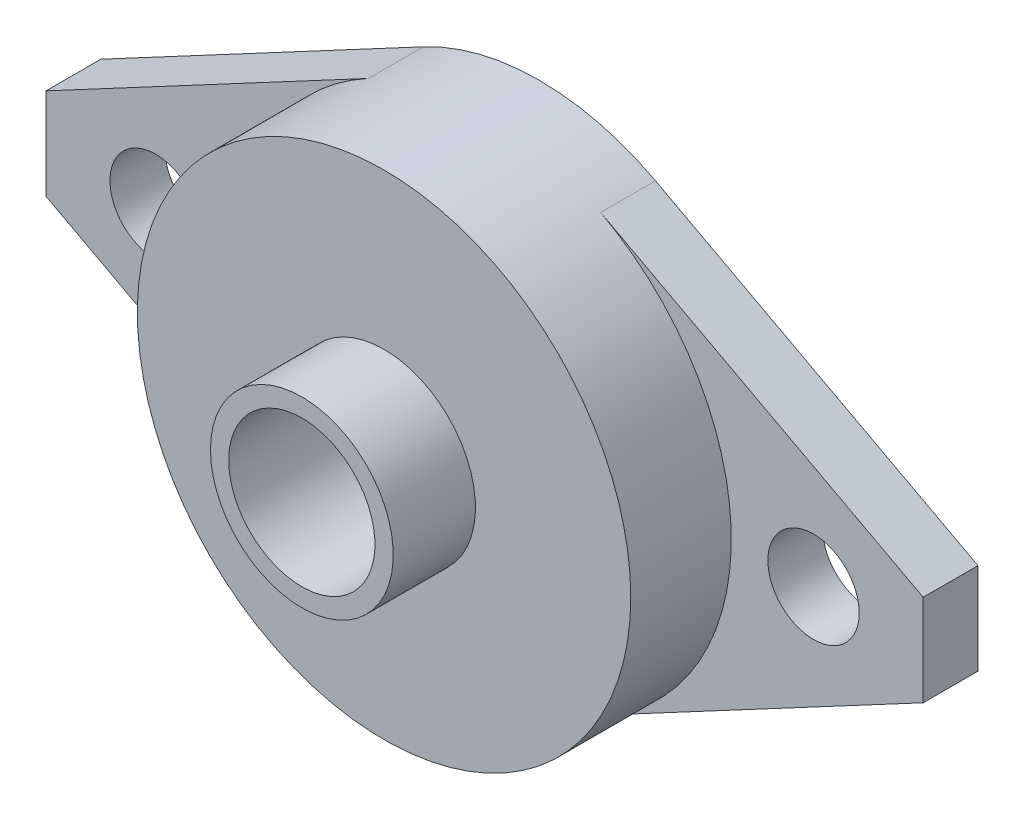
ISO-10303-21;
HEADER;
FILE_DESCRIPTION(('STEP AP214'),'2;1');
FILE_NAME('part.step','',(''),(''),'','','');
FILE_SCHEMA(('AUTOMOTIVE_DESIGN { 1 0 10303 214 1 1 1 1 }'));
ENDSEC;
DATA;
#1=APPLICATION_CONTEXT('core data for automotive mechanical design processes');
#2=APPLICATION_PROTOCOL_DEFINITION('international standard','automotive_design',2000,#1);
#3=PRODUCT_CONTEXT('',#1,'mechanical');
#4=PRODUCT('Part','Part','',(#3));
#5=PRODUCT_RELATED_PRODUCT_CATEGORY('part','',(#4));
#6=PRODUCT_DEFINITION_FORMATION('','',#4);
#7=PRODUCT_DEFINITION_CONTEXT('part definition',#1,'design');
#8=PRODUCT_DEFINITION('design','',#6,#7);
#9=PRODUCT_DEFINITION_SHAPE('','',#8);
#10=(LENGTH_UNIT() NAMED_UNIT(*) SI_UNIT(.MILLI.,.METRE.));
#11=(NAMED_UNIT(*) PLANE_ANGLE_UNIT() SI_UNIT($,.RADIAN.));
#12=(NAMED_UNIT(*) SI_UNIT($,.STERADIAN.) SOLID_ANGLE_UNIT());
#13=UNCERTAINTY_MEASURE_WITH_UNIT(LENGTH_MEASURE(1.E-05),#10,'distance_accuracy_value','');
#14=(GEOMETRIC_REPRESENTATION_CONTEXT(3) GLOBAL_UNCERTAINTY_ASSIGNED_CONTEXT((#13)) GLOBAL_UNIT_ASSIGNED_CONTEXT((#10,
#11,#12)) REPRESENTATION_CONTEXT('',''));
#15=CARTESIAN_POINT('',(0.,0.,0.));
#16=DIRECTION('',(0.,0.,1.));
#17=DIRECTION('',(1.,0.,0.));
#18=AXIS2_PLACEMENT_3D('',#15,#16,#17);
#19=CARTESIAN_POINT('',(0.,0.,3.));
#20=DIRECTION('',(0.,0.,1.));
#21=DIRECTION('',(1.,0.,0.));
#22=AXIS2_PLACEMENT_3D('',#19,#20,#21);
#23=PLANE('',#22);
#24=CARTESIAN_POINT('',(-18.,0.,3.));
#25=DIRECTION('',(0.,0.,1.));
#26=DIRECTION('',(1.,0.,0.));
#27=AXIS2_PLACEMENT_3D('',#24,#25,#26);
#28=CIRCLE('',#27,2.5);
#29=CARTESIAN_POINT('',(-15.5,0.,3.));
#30=VERTEX_POINT('',#29);
#31=EDGE_CURVE('E153',#30,#30,#28,.T.);
#32=ORIENTED_EDGE('',*,*,#31,.F.);
#33=EDGE_LOOP('',(#32));
#34=FACE_BOUND('',#33,.T.);
#35=DIRECTION('',(0.882352941176471,-0.470588235294118,0.));
#36=VECTOR('',#35,1.);
#37=CARTESIAN_POINT('',(-6.35294117647059,-11.9117647058824,3.));
#38=LINE('',#37,#36);
#39=CARTESIAN_POINT('',(-24.,-2.5,3.));
#40=VERTEX_POINT('',#39);
#41=CARTESIAN_POINT('',(-6.35294117647059,-11.9117647058824,3.));
#42=VERTEX_POINT('',#41);
#43=EDGE_CURVE('E184',#40,#42,#38,.T.);
#44=ORIENTED_EDGE('',*,*,#43,.T.);
#45=CARTESIAN_POINT('',(0.,0.,3.));
#46=DIRECTION('',(0.,0.,1.));
#47=DIRECTION('',(1.,0.,0.));
#48=AXIS2_PLACEMENT_3D('',#45,#46,#47);
#49=CIRCLE('',#48,13.5);
#50=CARTESIAN_POINT('',(-6.35294117647059,11.9117647058824,3.));
#51=VERTEX_POINT('',#50);
#52=EDGE_CURVE('E162',#42,#51,#49,.F.);
#53=ORIENTED_EDGE('',*,*,#52,.T.);
#54=DIRECTION('',(0.882352941176471,0.470588235294118,0.));
#55=VECTOR('',#54,1.);
#56=CARTESIAN_POINT('',(-6.35294117647059,11.9117647058824,3.));
#57=LINE('',#56,#55);
#58=CARTESIAN_POINT('',(-24.,2.5,3.));
#59=VERTEX_POINT('',#58);
#60=EDGE_CURVE('E145',#59,#51,#57,.T.);
#61=ORIENTED_EDGE('',*,*,#60,.F.);
#62=DIRECTION('',(0.,1.,0.));
#63=VECTOR('',#62,1.);
#64=CARTESIAN_POINT('',(-24.,0.,3.));
#65=LINE('',#64,#63);
#66=EDGE_CURVE('E148',#40,#59,#65,.T.);
#67=ORIENTED_EDGE('',*,*,#66,.F.);
#68=EDGE_LOOP('',(#44,#53,#61,#67));
#69=FACE_BOUND('',#68,.T.);
#70=ADVANCED_FACE('F56',(#34,#69),#23,.T.);
#71=CARTESIAN_POINT('',(-6.35294117647059,-11.9117647058824,3.));
#72=DIRECTION('',(0.470588235294118,0.882352941176471,0.));
#73=DIRECTION('',(-0.882352941176471,0.470588235294118,0.));
#74=AXIS2_PLACEMENT_3D('',#71,#72,#73);
#75=PLANE('',#74);
#76=DIRECTION('',(0.882352941176471,-0.470588235294118,0.));
#77=VECTOR('',#76,1.);
#78=CARTESIAN_POINT('',(-6.35294117647059,-11.9117647058824,0.));
#79=LINE('',#78,#77);
#80=CARTESIAN_POINT('',(-24.,-2.5,0.));
#81=VERTEX_POINT('',#80);
#82=CARTESIAN_POINT('',(-6.35294117647059,-11.9117647058824,0.));
#83=VERTEX_POINT('',#82);
#84=EDGE_CURVE('E159',#81,#83,#79,.T.);
#85=ORIENTED_EDGE('',*,*,#84,.T.);
#86=DIRECTION('',(0.,0.,-1.));
#87=VECTOR('',#86,1.);
#88=CARTESIAN_POINT('',(-6.35294117647059,-11.9117647058824,3.));
#89=LINE('',#88,#87);
#90=EDGE_CURVE('E12',#42,#83,#89,.T.);
#91=ORIENTED_EDGE('',*,*,#90,.F.);
#92=ORIENTED_EDGE('',*,*,#43,.F.);
#93=DIRECTION('',(0.,0.,-1.));
#94=VECTOR('',#93,1.);
#95=CARTESIAN_POINT('',(-24.,-2.5,3.));
#96=LINE('',#95,#94);
#97=EDGE_CURVE('E73',#40,#81,#96,.T.);
#98=ORIENTED_EDGE('',*,*,#97,.T.);
#99=EDGE_LOOP('',(#85,#91,#92,#98));
#100=FACE_BOUND('',#99,.T.);
#101=ADVANCED_FACE('F58',(#100),#75,.F.);
#102=CARTESIAN_POINT('',(6.35294117647059,-11.9117647058824,3.));
#103=DIRECTION('',(0.470588235294118,-0.882352941176471,0.));
#104=DIRECTION('',(0.882352941176471,0.470588235294118,0.));
#105=AXIS2_PLACEMENT_3D('',#102,#103,#104);
#106=PLANE('',#105);
#107=DIRECTION('',(-0.882352941176471,-0.470588235294118,0.));
#108=VECTOR('',#107,1.);
#109=CARTESIAN_POINT('',(6.35294117647059,-11.9117647058824,0.));
#110=LINE('',#109,#108);
#111=CARTESIAN_POINT('',(24.,-2.5,0.));
#112=VERTEX_POINT('',#111);
#113=CARTESIAN_POINT('',(6.35294117647059,-11.9117647058824,0.));
#114=VERTEX_POINT('',#113);
#115=EDGE_CURVE('E165',#112,#114,#110,.T.);
#116=ORIENTED_EDGE('',*,*,#115,.F.);
#117=DIRECTION('',(0.,0.,-1.));
#118=VECTOR('',#117,1.);
#119=CARTESIAN_POINT('',(24.,-2.5,3.));
#120=LINE('',#119,#118);
#121=CARTESIAN_POINT('',(24.,-2.5,3.));
#122=VERTEX_POINT('',#121);
#123=EDGE_CURVE('E140',#122,#112,#120,.T.);
#124=ORIENTED_EDGE('',*,*,#123,.F.);
#125=DIRECTION('',(-0.882352941176471,-0.470588235294118,0.));
#126=VECTOR('',#125,1.);
#127=CARTESIAN_POINT('',(6.35294117647059,-11.9117647058824,3.));
#128=LINE('',#127,#126);
#129=CARTESIAN_POINT('',(6.35294117647059,-11.9117647058824,3.));
#130=VERTEX_POINT('',#129);
#131=EDGE_CURVE('E130',#122,#130,#128,.T.);
#132=ORIENTED_EDGE('',*,*,#131,.T.);
#133=DIRECTION('',(0.,0.,-1.));
#134=VECTOR('',#133,1.);
#135=CARTESIAN_POINT('',(6.35294117647059,-11.9117647058824,3.));
#136=LINE('',#135,#134);
#137=EDGE_CURVE('E65',#130,#114,#136,.T.);
#138=ORIENTED_EDGE('',*,*,#137,.T.);
#139=EDGE_LOOP('',(#116,#124,#132,#138));
#140=FACE_BOUND('',#139,.T.);
#141=ADVANCED_FACE('F192',(#140),#106,.T.);
#142=CARTESIAN_POINT('',(24.,0.,3.));
#143=DIRECTION('',(-1.,0.,0.));
#144=DIRECTION('',(0.,0.,1.));
#145=AXIS2_PLACEMENT_3D('',#142,#143,#144);
#146=PLANE('',#145);
#147=DIRECTION('',(0.,1.,0.));
#148=VECTOR('',#147,1.);
#149=CARTESIAN_POINT('',(24.,0.,0.));
#150=LINE('',#149,#148);
#151=CARTESIAN_POINT('',(24.,2.5,0.));
#152=VERTEX_POINT('',#151);
#153=EDGE_CURVE('E137',#112,#152,#150,.T.);
#154=ORIENTED_EDGE('',*,*,#153,.T.);
#155=DIRECTION('',(0.,0.,-1.));
#156=VECTOR('',#155,1.);
#157=CARTESIAN_POINT('',(24.,2.5,3.));
#158=LINE('',#157,#156);
#159=CARTESIAN_POINT('',(24.,2.5,3.));
#160=VERTEX_POINT('',#159);
#161=EDGE_CURVE('E134',#160,#152,#158,.T.);
#162=ORIENTED_EDGE('',*,*,#161,.F.);
#163=DIRECTION('',(0.,1.,0.));
#164=VECTOR('',#163,1.);
#165=CARTESIAN_POINT('',(24.,0.,3.));
#166=LINE('',#165,#164);
#167=EDGE_CURVE('E121',#122,#160,#166,.T.);
#168=ORIENTED_EDGE('',*,*,#167,.F.);
#169=ORIENTED_EDGE('',*,*,#123,.T.);
#170=EDGE_LOOP('',(#154,#162,#168,#169));
#171=FACE_BOUND('',#170,.T.);
#172=ADVANCED_FACE('F135',(#171),#146,.F.);
#173=CARTESIAN_POINT('',(6.35294117647059,11.9117647058824,3.));
#174=DIRECTION('',(-0.470588235294118,-0.882352941176471,0.));
#175=DIRECTION('',(0.882352941176471,-0.470588235294118,0.));
#176=AXIS2_PLACEMENT_3D('',#173,#174,#175);
#177=PLANE('',#176);
#178=DIRECTION('',(-0.882352941176471,0.470588235294118,0.));
#179=VECTOR('',#178,1.);
#180=CARTESIAN_POINT('',(6.35294117647059,11.9117647058824,0.));
#181=LINE('',#180,#179);
#182=CARTESIAN_POINT('',(6.35294117647059,11.9117647058824,0.));
#183=VERTEX_POINT('',#182);
#184=EDGE_CURVE('E170',#152,#183,#181,.T.);
#185=ORIENTED_EDGE('',*,*,#184,.T.);
#186=DIRECTION('',(0.,0.,-1.));
#187=VECTOR('',#186,1.);
#188=CARTESIAN_POINT('',(6.35294117647059,11.9117647058824,3.));
#189=LINE('',#188,#187);
#190=CARTESIAN_POINT('',(6.35294117647059,11.9117647058824,3.));
#191=VERTEX_POINT('',#190);
#192=EDGE_CURVE('E141',#191,#183,#189,.T.);
#193=ORIENTED_EDGE('',*,*,#192,.F.);
#194=DIRECTION('',(-0.882352941176471,0.470588235294118,0.));
#195=VECTOR('',#194,1.);
#196=CARTESIAN_POINT('',(6.35294117647059,11.9117647058824,3.));
#197=LINE('',#196,#195);
#198=EDGE_CURVE('E127',#160,#191,#197,.T.);
#199=ORIENTED_EDGE('',*,*,#198,.F.);
#200=ORIENTED_EDGE('',*,*,#161,.T.);
#201=EDGE_LOOP('',(#185,#193,#199,#200));
#202=FACE_BOUND('',#201,.T.);
#203=ADVANCED_FACE('F143',(#202),#177,.F.);
#204=CARTESIAN_POINT('',(0.,0.,3.));
#205=DIRECTION('',(0.,0.,-1.));
#206=DIRECTION('',(-1.,0.,0.));
#207=AXIS2_PLACEMENT_3D('',#204,#205,#206);
#208=CYLINDRICAL_SURFACE('',#207,13.5);
#209=CARTESIAN_POINT('',(0.,0.,0.));
#210=DIRECTION('',(0.,0.,1.));
#211=DIRECTION('',(1.,0.,0.));
#212=AXIS2_PLACEMENT_3D('',#209,#210,#211);
#213=CIRCLE('',#212,13.5);
#214=CARTESIAN_POINT('',(-6.35294117647059,11.9117647058824,0.));
#215=VERTEX_POINT('',#214);
#216=EDGE_CURVE('E166',#183,#215,#213,.T.);
#217=ORIENTED_EDGE('',*,*,#216,.T.);
#218=DIRECTION('',(0.,0.,-1.));
#219=VECTOR('',#218,1.);
#220=CARTESIAN_POINT('',(-6.35294117647059,11.9117647058824,3.));
#221=LINE('',#220,#219);
#222=EDGE_CURVE('E187',#51,#215,#221,.T.);
#223=ORIENTED_EDGE('',*,*,#222,.F.);
#224=ORIENTED_EDGE('',*,*,#52,.F.);
#225=ORIENTED_EDGE('',*,*,#90,.T.);
#226=EDGE_CURVE('E161',#83,#114,#213,.T.);
#227=ORIENTED_EDGE('',*,*,#226,.T.);
#228=ORIENTED_EDGE('',*,*,#137,.F.);
#229=EDGE_CURVE('E113',#191,#130,#49,.F.);
#230=ORIENTED_EDGE('',*,*,#229,.F.);
#231=ORIENTED_EDGE('',*,*,#192,.T.);
#232=EDGE_LOOP('',(#217,#223,#224,#225,#227,#228,#230,#231));
#233=FACE_BOUND('',#232,.T.);
#234=CARTESIAN_POINT('',(0.,0.,8.5));
#235=DIRECTION('',(0.,0.,1.));
#236=DIRECTION('',(1.,0.,0.));
#237=AXIS2_PLACEMENT_3D('',#234,#235,#236);
#238=CIRCLE('',#237,13.5);
#239=CARTESIAN_POINT('',(13.5,0.,8.5));
#240=VERTEX_POINT('',#239);
#241=EDGE_CURVE('E206',#240,#240,#238,.T.);
#242=ORIENTED_EDGE('',*,*,#241,.F.);
#243=EDGE_LOOP('',(#242));
#244=FACE_BOUND('',#243,.T.);
#245=ADVANCED_FACE('F195',(#233,#244),#208,.T.);
#246=CARTESIAN_POINT('',(-6.35294117647059,11.9117647058824,3.));
#247=DIRECTION('',(-0.470588235294118,0.882352941176471,0.));
#248=DIRECTION('',(-0.882352941176471,-0.470588235294118,0.));
#249=AXIS2_PLACEMENT_3D('',#246,#247,#248);
#250=PLANE('',#249);
#251=DIRECTION('',(0.882352941176471,0.470588235294118,0.));
#252=VECTOR('',#251,1.);
#253=CARTESIAN_POINT('',(-6.35294117647059,11.9117647058824,0.));
#254=LINE('',#253,#252);
#255=CARTESIAN_POINT('',(-24.,2.5,0.));
#256=VERTEX_POINT('',#255);
#257=EDGE_CURVE('E172',#256,#215,#254,.T.);
#258=ORIENTED_EDGE('',*,*,#257,.F.);
#259=DIRECTION('',(0.,0.,-1.));
#260=VECTOR('',#259,1.);
#261=CARTESIAN_POINT('',(-24.,2.5,3.));
#262=LINE('',#261,#260);
#263=EDGE_CURVE('E100',#59,#256,#262,.T.);
#264=ORIENTED_EDGE('',*,*,#263,.F.);
#265=ORIENTED_EDGE('',*,*,#60,.T.);
#266=ORIENTED_EDGE('',*,*,#222,.T.);
#267=EDGE_LOOP('',(#258,#264,#265,#266));
#268=FACE_BOUND('',#267,.T.);
#269=ADVANCED_FACE('F229',(#268),#250,.T.);
#270=CARTESIAN_POINT('',(-18.,0.,3.));
#271=DIRECTION('',(0.,0.,-1.));
#272=DIRECTION('',(-1.,0.,0.));
#273=AXIS2_PLACEMENT_3D('',#270,#271,#272);
#274=CYLINDRICAL_SURFACE('',#273,2.5);
#275=ORIENTED_EDGE('',*,*,#31,.T.);
#276=EDGE_LOOP('',(#275));
#277=FACE_BOUND('',#276,.T.);
#278=CARTESIAN_POINT('',(-18.,0.,0.));
#279=DIRECTION('',(0.,0.,1.));
#280=DIRECTION('',(1.,0.,0.));
#281=AXIS2_PLACEMENT_3D('',#278,#279,#280);
#282=CIRCLE('',#281,2.5);
#283=CARTESIAN_POINT('',(-15.5,0.,0.));
#284=VERTEX_POINT('',#283);
#285=EDGE_CURVE('E178',#284,#284,#282,.T.);
#286=ORIENTED_EDGE('',*,*,#285,.F.);
#287=EDGE_LOOP('',(#286));
#288=FACE_BOUND('',#287,.T.);
#289=ADVANCED_FACE('F221',(#277,#288),#274,.F.);
#290=CARTESIAN_POINT('',(-24.,0.,3.));
#291=DIRECTION('',(-1.,0.,0.));
#292=DIRECTION('',(0.,0.,1.));
#293=AXIS2_PLACEMENT_3D('',#290,#291,#292);
#294=PLANE('',#293);
#295=DIRECTION('',(0.,1.,0.));
#296=VECTOR('',#295,1.);
#297=CARTESIAN_POINT('',(-24.,0.,0.));
#298=LINE('',#297,#296);
#299=EDGE_CURVE('E175',#81,#256,#298,.T.);
#300=ORIENTED_EDGE('',*,*,#299,.F.);
#301=ORIENTED_EDGE('',*,*,#97,.F.);
#302=ORIENTED_EDGE('',*,*,#66,.T.);
#303=ORIENTED_EDGE('',*,*,#263,.T.);
#304=EDGE_LOOP('',(#300,#301,#302,#303));
#305=FACE_BOUND('',#304,.T.);
#306=ADVANCED_FACE('F218',(#305),#294,.T.);
#307=CARTESIAN_POINT('',(18.,0.,3.));
#308=DIRECTION('',(0.,0.,-1.));
#309=DIRECTION('',(-1.,0.,0.));
#310=AXIS2_PLACEMENT_3D('',#307,#308,#309);
#311=CYLINDRICAL_SURFACE('',#310,2.5);
#312=CARTESIAN_POINT('',(18.,0.,3.));
#313=DIRECTION('',(0.,0.,1.));
#314=DIRECTION('',(1.,0.,0.));
#315=AXIS2_PLACEMENT_3D('',#312,#313,#314);
#316=CIRCLE('',#315,2.5);
#317=CARTESIAN_POINT('',(20.5,0.,3.));
#318=VERTEX_POINT('',#317);
#319=EDGE_CURVE('E156',#318,#318,#316,.F.);
#320=ORIENTED_EDGE('',*,*,#319,.F.);
#321=EDGE_LOOP('',(#320));
#322=FACE_BOUND('',#321,.T.);
#323=CARTESIAN_POINT('',(18.,0.,0.));
#324=DIRECTION('',(0.,0.,1.));
#325=DIRECTION('',(1.,0.,0.));
#326=AXIS2_PLACEMENT_3D('',#323,#324,#325);
#327=CIRCLE('',#326,2.5);
#328=CARTESIAN_POINT('',(20.5,0.,0.));
#329=VERTEX_POINT('',#328);
#330=EDGE_CURVE('E181',#329,#329,#327,.F.);
#331=ORIENTED_EDGE('',*,*,#330,.T.);
#332=EDGE_LOOP('',(#331));
#333=FACE_BOUND('',#332,.T.);
#334=ADVANCED_FACE('F220',(#322,#333),#311,.F.);
#335=ORIENTED_EDGE('',*,*,#198,.T.);
#336=ORIENTED_EDGE('',*,*,#229,.T.);
#337=ORIENTED_EDGE('',*,*,#131,.F.);
#338=ORIENTED_EDGE('',*,*,#167,.T.);
#339=EDGE_LOOP('',(#335,#336,#337,#338));
#340=FACE_BOUND('',#339,.T.);
#341=ORIENTED_EDGE('',*,*,#319,.T.);
#342=EDGE_LOOP('',(#341));
#343=FACE_BOUND('',#342,.T.);
#344=ADVANCED_FACE('F123',(#340,#343),#23,.T.);
#345=CARTESIAN_POINT('',(0.,0.,0.));
#346=DIRECTION('',(0.,0.,1.));
#347=DIRECTION('',(1.,0.,0.));
#348=AXIS2_PLACEMENT_3D('',#345,#346,#347);
#349=PLANE('',#348);
#350=ORIENTED_EDGE('',*,*,#115,.T.);
#351=ORIENTED_EDGE('',*,*,#226,.F.);
#352=ORIENTED_EDGE('',*,*,#84,.F.);
#353=ORIENTED_EDGE('',*,*,#299,.T.);
#354=ORIENTED_EDGE('',*,*,#257,.T.);
#355=ORIENTED_EDGE('',*,*,#216,.F.);
#356=ORIENTED_EDGE('',*,*,#184,.F.);
#357=ORIENTED_EDGE('',*,*,#153,.F.);
#358=EDGE_LOOP('',(#350,#351,#352,#353,#354,#355,#356,#357));
#359=FACE_BOUND('',#358,.T.);
#360=ORIENTED_EDGE('',*,*,#330,.F.);
#361=EDGE_LOOP('',(#360));
#362=FACE_BOUND('',#361,.T.);
#363=ORIENTED_EDGE('',*,*,#285,.T.);
#364=EDGE_LOOP('',(#363));
#365=FACE_BOUND('',#364,.T.);
#366=CARTESIAN_POINT('',(0.,0.,0.));
#367=DIRECTION('',(0.,0.,1.));
#368=DIRECTION('',(1.,0.,0.));
#369=AXIS2_PLACEMENT_3D('',#366,#367,#368);
#370=CIRCLE('',#369,4.);
#371=CARTESIAN_POINT('',(-4.,0.,0.));
#372=VERTEX_POINT('',#371);
#373=EDGE_CURVE('E279',#372,#372,#370,.T.);
#374=ORIENTED_EDGE('',*,*,#373,.T.);
#375=EDGE_LOOP('',(#374));
#376=FACE_BOUND('',#375,.T.);
#377=ADVANCED_FACE('F200',(#359,#362,#365,#376),#349,.F.);
#378=CARTESIAN_POINT('',(0.,0.,8.5));
#379=DIRECTION('',(0.,0.,1.));
#380=DIRECTION('',(1.,0.,0.));
#381=AXIS2_PLACEMENT_3D('',#378,#379,#380);
#382=PLANE('',#381);
#383=CARTESIAN_POINT('',(0.,0.,8.5));
#384=DIRECTION('',(0.,0.,1.));
#385=DIRECTION('',(1.,0.,0.));
#386=AXIS2_PLACEMENT_3D('',#383,#384,#385);
#387=CIRCLE('',#386,5.);
#388=CARTESIAN_POINT('',(-5.,0.,8.5));
#389=VERTEX_POINT('',#388);
#390=EDGE_CURVE('E210',#389,#389,#387,.T.);
#391=ORIENTED_EDGE('',*,*,#390,.F.);
#392=EDGE_LOOP('',(#391));
#393=FACE_BOUND('',#392,.T.);
#394=ORIENTED_EDGE('',*,*,#241,.T.);
#395=EDGE_LOOP('',(#394));
#396=FACE_BOUND('',#395,.T.);
#397=ADVANCED_FACE('F246',(#393,#396),#382,.T.);
#398=CARTESIAN_POINT('',(0.,0.,13.));
#399=DIRECTION('',(0.,0.,-1.));
#400=DIRECTION('',(-1.,0.,0.));
#401=AXIS2_PLACEMENT_3D('',#398,#399,#400);
#402=CYLINDRICAL_SURFACE('',#401,4.);
#403=CARTESIAN_POINT('',(0.,0.,13.));
#404=DIRECTION('',(0.,0.,1.));
#405=DIRECTION('',(1.,0.,0.));
#406=AXIS2_PLACEMENT_3D('',#403,#404,#405);
#407=CIRCLE('',#406,4.);
#408=CARTESIAN_POINT('',(-4.,0.,13.));
#409=VERTEX_POINT('',#408);
#410=EDGE_CURVE('E272',#409,#409,#407,.T.);
#411=CARTESIAN_POINT('',(-4.,0.,13.));
#412=CARTESIAN_POINT('',(-4.,0.,12.8645833333333));
#413=CARTESIAN_POINT('',(-4.,0.,12.7291666666667));
#414=CARTESIAN_POINT('',(-4.,0.,12.4583333333333));
#415=CARTESIAN_POINT('',(-4.,0.,12.3229166666667));
#416=CARTESIAN_POINT('',(-4.,0.,12.0520833333333));
#417=CARTESIAN_POINT('',(-4.,0.,11.9166666666667));
#418=CARTESIAN_POINT('',(-4.,0.,11.6458333333333));
#419=CARTESIAN_POINT('',(-4.,0.,11.5104166666667));
#420=CARTESIAN_POINT('',(-4.,0.,11.2395833333333));
#421=CARTESIAN_POINT('',(-4.,0.,11.1041666666667));
#422=CARTESIAN_POINT('',(-4.,0.,10.8333333333333));
#423=CARTESIAN_POINT('',(-4.,0.,10.6979166666667));
#424=CARTESIAN_POINT('',(-4.,0.,10.4270833333333));
#425=CARTESIAN_POINT('',(-4.,0.,10.2916666666667));
#426=CARTESIAN_POINT('',(-4.,0.,10.0208333333333));
#427=CARTESIAN_POINT('',(-4.,0.,9.88541666666667));
#428=CARTESIAN_POINT('',(-4.,0.,9.61458333333333));
#429=CARTESIAN_POINT('',(-4.,0.,9.47916666666667));
#430=CARTESIAN_POINT('',(-4.,0.,9.20833333333333));
#431=CARTESIAN_POINT('',(-4.,0.,9.07291666666667));
#432=CARTESIAN_POINT('',(-4.,0.,8.80208333333333));
#433=CARTESIAN_POINT('',(-4.,0.,8.66666666666667));
#434=CARTESIAN_POINT('',(-4.,0.,8.39583333333333));
#435=CARTESIAN_POINT('',(-4.,0.,8.26041666666667));
#436=CARTESIAN_POINT('',(-4.,0.,7.98958333333333));
#437=CARTESIAN_POINT('',(-4.,0.,7.85416666666667));
#438=CARTESIAN_POINT('',(-4.,0.,7.58333333333333));
#439=CARTESIAN_POINT('',(-4.,0.,7.44791666666667));
#440=CARTESIAN_POINT('',(-4.,0.,7.17708333333333));
#441=CARTESIAN_POINT('',(-4.,0.,7.04166666666667));
#442=CARTESIAN_POINT('',(-4.,0.,6.77083333333333));
#443=CARTESIAN_POINT('',(-4.,0.,6.63541666666667));
#444=CARTESIAN_POINT('',(-4.,0.,6.36458333333333));
#445=CARTESIAN_POINT('',(-4.,0.,6.22916666666667));
#446=CARTESIAN_POINT('',(-4.,0.,5.95833333333333));
#447=CARTESIAN_POINT('',(-4.,0.,5.82291666666667));
#448=CARTESIAN_POINT('',(-4.,0.,5.55208333333333));
#449=CARTESIAN_POINT('',(-4.,0.,5.41666666666667));
#450=CARTESIAN_POINT('',(-4.,0.,5.14583333333333));
#451=CARTESIAN_POINT('',(-4.,0.,5.01041666666667));
#452=CARTESIAN_POINT('',(-4.,0.,4.73958333333333));
#453=CARTESIAN_POINT('',(-4.,0.,4.60416666666667));
#454=CARTESIAN_POINT('',(-4.,0.,4.33333333333333));
#455=CARTESIAN_POINT('',(-4.,0.,4.19791666666667));
#456=CARTESIAN_POINT('',(-4.,0.,3.92708333333333));
#457=CARTESIAN_POINT('',(-4.,0.,3.79166666666667));
#458=CARTESIAN_POINT('',(-4.,0.,3.52083333333333));
#459=CARTESIAN_POINT('',(-4.,0.,3.38541666666667));
#460=CARTESIAN_POINT('',(-4.,0.,3.11458333333333));
#461=CARTESIAN_POINT('',(-4.,0.,2.97916666666667));
#462=CARTESIAN_POINT('',(-4.,0.,2.70833333333333));
#463=CARTESIAN_POINT('',(-4.,0.,2.57291666666667));
#464=CARTESIAN_POINT('',(-4.,0.,2.30208333333333));
#465=CARTESIAN_POINT('',(-4.,0.,2.16666666666667));
#466=CARTESIAN_POINT('',(-4.,0.,1.89583333333333));
#467=CARTESIAN_POINT('',(-4.,0.,1.76041666666667));
#468=CARTESIAN_POINT('',(-4.,0.,1.48958333333333));
#469=CARTESIAN_POINT('',(-4.,0.,1.35416666666667));
#470=CARTESIAN_POINT('',(-4.,0.,1.08333333333333));
#471=CARTESIAN_POINT('',(-4.,0.,0.947916666666667));
#472=CARTESIAN_POINT('',(-4.,0.,0.677083333333334));
#473=CARTESIAN_POINT('',(-4.,0.,0.541666666666667));
#474=CARTESIAN_POINT('',(-4.,0.,0.270833333333334));
#475=CARTESIAN_POINT('',(-4.,0.,0.135416666666667));
#476=CARTESIAN_POINT('',(-4.,0.,0.));
#477=B_SPLINE_CURVE_WITH_KNOTS('',3,(#411,#412,#413,#414,#415,#416,#417,#418,#419,#420,#421,
#422,#423,#424,#425,#426,#427,#428,#429,#430,#431,#432,#433,#434,#435,#436,#437,#438,#439,#440,
#441,#442,#443,#444,#445,#446,#447,#448,#449,#450,#451,#452,#453,#454,#455,#456,#457,#458,#459,
#460,#461,#462,#463,#464,#465,#466,#467,#468,#469,#470,#471,#472,#473,#474,#475,#476),
.UNSPECIFIED.,.F.,.F.,(4,2,2,2,2,2,2,2,2,2,2,2,2,2,2,2,2,2,2,2,2,2,2,2,2,2,2,2,2,2,2,2,4),(0.,
0.406249999999999,0.812499999999999,1.21875,1.625,2.03125,2.4375,2.84375,3.25,3.65625,4.0625,
4.46875,4.875,5.28125,5.6875,6.09375,6.5,6.90625,7.3125,7.71875,8.125,8.53125,8.9375,9.34375,
9.75,10.15625,10.5625,10.96875,11.375,11.78125,12.1875,12.59375,13.),.UNSPECIFIED.);
#478=EDGE_CURVE('BSEAM250',#409,#372,#477,.T.);
#479=ORIENTED_EDGE('',*,*,#410,.T.);
#480=ORIENTED_EDGE('',*,*,#373,.F.);
#481=ORIENTED_EDGE('',*,*,#478,.T.);
#482=ORIENTED_EDGE('',*,*,#478,.F.);
#483=EDGE_LOOP('',(#479,#481,#480,#482));
#484=FACE_BOUND('',#483,.T.);
#485=ADVANCED_FACE('F250',(#484),#402,.F.);
#486=CARTESIAN_POINT('',(0.,0.,13.));
#487=DIRECTION('',(0.,0.,-1.));
#488=DIRECTION('',(-1.,0.,0.));
#489=AXIS2_PLACEMENT_3D('',#486,#487,#488);
#490=CYLINDRICAL_SURFACE('',#489,5.);
#491=CARTESIAN_POINT('',(0.,0.,13.));
#492=DIRECTION('',(0.,0.,1.));
#493=DIRECTION('',(1.,0.,0.));
#494=AXIS2_PLACEMENT_3D('',#491,#492,#493);
#495=CIRCLE('',#494,5.);
#496=CARTESIAN_POINT('',(-5.,0.,13.));
#497=VERTEX_POINT('',#496);
#498=EDGE_CURVE('E275',#497,#497,#495,.T.);
#499=CARTESIAN_POINT('',(-5.,0.,8.5));
#500=CARTESIAN_POINT('',(-5.,0.,8.546875));
#501=CARTESIAN_POINT('',(-5.,0.,8.59375));
#502=CARTESIAN_POINT('',(-5.,0.,8.6875));
#503=CARTESIAN_POINT('',(-5.,0.,8.734375));
#504=CARTESIAN_POINT('',(-5.,0.,8.828125));
#505=CARTESIAN_POINT('',(-5.,0.,8.875));
#506=CARTESIAN_POINT('',(-5.,0.,8.96875));
#507=CARTESIAN_POINT('',(-5.,0.,9.015625));
#508=CARTESIAN_POINT('',(-5.,0.,9.109375));
#509=CARTESIAN_POINT('',(-5.,0.,9.15625));
#510=CARTESIAN_POINT('',(-5.,0.,9.25));
#511=CARTESIAN_POINT('',(-5.,0.,9.296875));
#512=CARTESIAN_POINT('',(-5.,0.,9.390625));
#513=CARTESIAN_POINT('',(-5.,0.,9.4375));
#514=CARTESIAN_POINT('',(-5.,0.,9.53125));
#515=CARTESIAN_POINT('',(-5.,0.,9.578125));
#516=CARTESIAN_POINT('',(-5.,0.,9.671875));
#517=CARTESIAN_POINT('',(-5.,0.,9.71875));
#518=CARTESIAN_POINT('',(-5.,0.,9.8125));
#519=CARTESIAN_POINT('',(-5.,0.,9.859375));
#520=CARTESIAN_POINT('',(-5.,0.,9.953125));
#521=CARTESIAN_POINT('',(-5.,0.,10.));
#522=CARTESIAN_POINT('',(-5.,0.,10.09375));
#523=CARTESIAN_POINT('',(-5.,0.,10.140625));
#524=CARTESIAN_POINT('',(-5.,0.,10.234375));
#525=CARTESIAN_POINT('',(-5.,0.,10.28125));
#526=CARTESIAN_POINT('',(-5.,0.,10.375));
#527=CARTESIAN_POINT('',(-5.,0.,10.421875));
#528=CARTESIAN_POINT('',(-5.,0.,10.515625));
#529=CARTESIAN_POINT('',(-5.,0.,10.5625));
#530=CARTESIAN_POINT('',(-5.,0.,10.65625));
#531=CARTESIAN_POINT('',(-5.,0.,10.703125));
#532=CARTESIAN_POINT('',(-5.,0.,10.796875));
#533=CARTESIAN_POINT('',(-5.,0.,10.84375));
#534=CARTESIAN_POINT('',(-5.,0.,10.9375));
#535=CARTESIAN_POINT('',(-5.,0.,10.984375));
#536=CARTESIAN_POINT('',(-5.,0.,11.078125));
#537=CARTESIAN_POINT('',(-5.,0.,11.125));
#538=CARTESIAN_POINT('',(-5.,0.,11.21875));
#539=CARTESIAN_POINT('',(-5.,0.,11.265625));
#540=CARTESIAN_POINT('',(-5.,0.,11.359375));
#541=CARTESIAN_POINT('',(-5.,0.,11.40625));
#542=CARTESIAN_POINT('',(-5.,0.,11.5));
#543=CARTESIAN_POINT('',(-5.,0.,11.546875));
#544=CARTESIAN_POINT('',(-5.,0.,11.640625));
#545=CARTESIAN_POINT('',(-5.,0.,11.6875));
#546=CARTESIAN_POINT('',(-5.,0.,11.78125));
#547=CARTESIAN_POINT('',(-5.,0.,11.828125));
#548=CARTESIAN_POINT('',(-5.,0.,11.921875));
#549=CARTESIAN_POINT('',(-5.,0.,11.96875));
#550=CARTESIAN_POINT('',(-5.,0.,12.0625));
#551=CARTESIAN_POINT('',(-5.,0.,12.109375));
#552=CARTESIAN_POINT('',(-5.,0.,12.203125));
#553=CARTESIAN_POINT('',(-5.,0.,12.25));
#554=CARTESIAN_POINT('',(-5.,0.,12.34375));
#555=CARTESIAN_POINT('',(-5.,0.,12.390625));
#556=CARTESIAN_POINT('',(-5.,0.,12.484375));
#557=CARTESIAN_POINT('',(-5.,0.,12.53125));
#558=CARTESIAN_POINT('',(-5.,0.,12.625));
#559=CARTESIAN_POINT('',(-5.,0.,12.671875));
#560=CARTESIAN_POINT('',(-5.,0.,12.765625));
#561=CARTESIAN_POINT('',(-5.,0.,12.8125));
#562=CARTESIAN_POINT('',(-5.,0.,12.90625));
#563=CARTESIAN_POINT('',(-5.,0.,12.953125));
#564=CARTESIAN_POINT('',(-5.,0.,13.));
#565=B_SPLINE_CURVE_WITH_KNOTS('',3,(#499,#500,#501,#502,#503,#504,#505,#506,#507,#508,#509,
#510,#511,#512,#513,#514,#515,#516,#517,#518,#519,#520,#521,#522,#523,#524,#525,#526,#527,#528,
#529,#530,#531,#532,#533,#534,#535,#536,#537,#538,#539,#540,#541,#542,#543,#544,#545,#546,#547,
#548,#549,#550,#551,#552,#553,#554,#555,#556,#557,#558,#559,#560,#561,#562,#563,#564),
.UNSPECIFIED.,.F.,.F.,(4,2,2,2,2,2,2,2,2,2,2,2,2,2,2,2,2,2,2,2,2,2,2,2,2,2,2,2,2,2,2,2,4),(0.,
0.140624999999998,0.28125,0.421874999999999,0.562499999999999,0.703124999999999,
0.843749999999999,0.984374999999999,1.125,1.265625,1.40625,1.546875,1.6875,1.828125,1.96875,
2.109375,2.25,2.390625,2.53125,2.671875,2.8125,2.953125,3.09375,3.234375,3.375,3.515625,3.65625,
3.796875,3.9375,4.078125,4.21875,4.359375,4.5),.UNSPECIFIED.);
#566=EDGE_CURVE('BSEAM255',#389,#497,#565,.T.);
#567=ORIENTED_EDGE('',*,*,#390,.T.);
#568=ORIENTED_EDGE('',*,*,#498,.F.);
#569=ORIENTED_EDGE('',*,*,#566,.T.);
#570=ORIENTED_EDGE('',*,*,#566,.F.);
#571=EDGE_LOOP('',(#567,#569,#568,#570));
#572=FACE_BOUND('',#571,.T.);
#573=ADVANCED_FACE('F255',(#572),#490,.T.);
#574=CARTESIAN_POINT('',(0.,0.,13.));
#575=DIRECTION('',(0.,0.,1.));
#576=DIRECTION('',(1.,0.,0.));
#577=AXIS2_PLACEMENT_3D('',#574,#575,#576);
#578=PLANE('',#577);
#579=ORIENTED_EDGE('',*,*,#410,.F.);
#580=EDGE_LOOP('',(#579));
#581=FACE_BOUND('',#580,.T.);
#582=ORIENTED_EDGE('',*,*,#498,.T.);
#583=EDGE_LOOP('',(#582));
#584=FACE_BOUND('',#583,.T.);
#585=ADVANCED_FACE('F263',(#581,#584),#578,.T.);
#586=CLOSED_SHELL('',(#70,#101,#141,#172,#203,#245,#269,#289,#306,#334,#344,#377,#397,#485,#573,#585));
#587=MANIFOLD_SOLID_BREP('B2',#586);
#588=ADVANCED_BREP_SHAPE_REPRESENTATION('',(#18,#587),#14);
#589=SHAPE_DEFINITION_REPRESENTATION(#9,#588);
ENDSEC;
END-ISO-10303-21;
